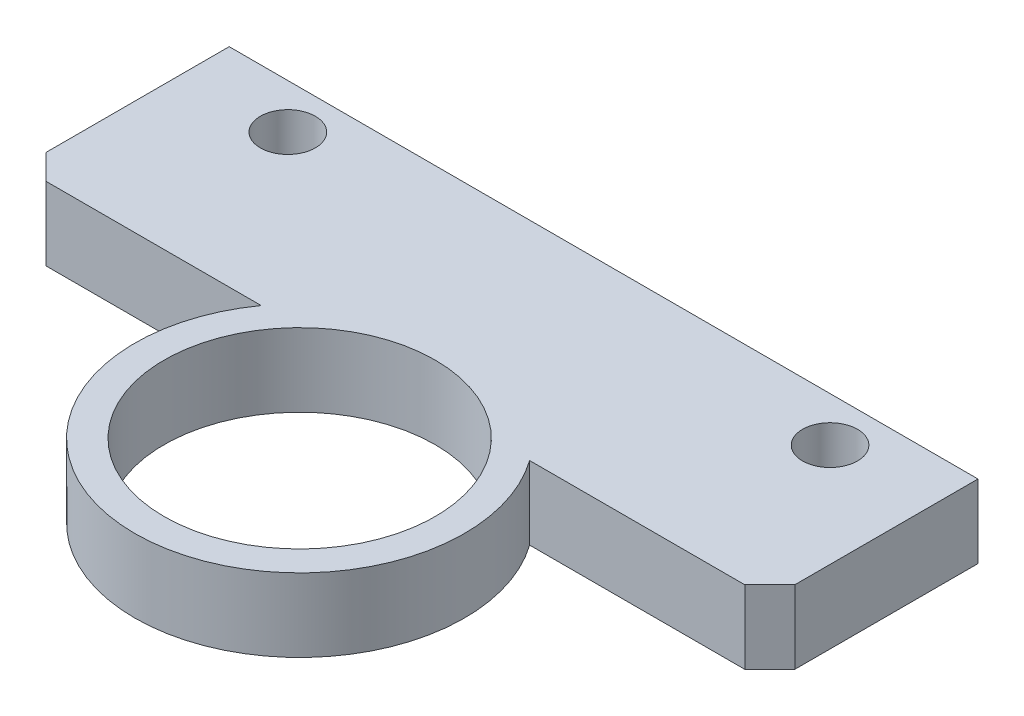
ISO-10303-21;
HEADER;
FILE_DESCRIPTION(('STEP AP214'),'2;1');
FILE_NAME('part.step','',(''),(''),'','','');
FILE_SCHEMA(('AUTOMOTIVE_DESIGN { 1 0 10303 214 1 1 1 1 }'));
ENDSEC;
DATA;
#1=APPLICATION_CONTEXT('core data for automotive mechanical design processes');
#2=APPLICATION_PROTOCOL_DEFINITION('international standard','automotive_design',2000,#1);
#3=PRODUCT_CONTEXT('',#1,'mechanical');
#4=PRODUCT('Part','Part','',(#3));
#5=PRODUCT_RELATED_PRODUCT_CATEGORY('part','',(#4));
#6=PRODUCT_DEFINITION_FORMATION('','',#4);
#7=PRODUCT_DEFINITION_CONTEXT('part definition',#1,'design');
#8=PRODUCT_DEFINITION('design','',#6,#7);
#9=PRODUCT_DEFINITION_SHAPE('','',#8);
#10=(LENGTH_UNIT() NAMED_UNIT(*) SI_UNIT(.MILLI.,.METRE.));
#11=(NAMED_UNIT(*) PLANE_ANGLE_UNIT() SI_UNIT($,.RADIAN.));
#12=(NAMED_UNIT(*) SI_UNIT($,.STERADIAN.) SOLID_ANGLE_UNIT());
#13=UNCERTAINTY_MEASURE_WITH_UNIT(LENGTH_MEASURE(1.E-05),#10,'distance_accuracy_value','');
#14=(GEOMETRIC_REPRESENTATION_CONTEXT(3) GLOBAL_UNCERTAINTY_ASSIGNED_CONTEXT((#13)) GLOBAL_UNIT_ASSIGNED_CONTEXT((#10,
#11,#12)) REPRESENTATION_CONTEXT('',''));
#15=CARTESIAN_POINT('',(0.,0.,0.));
#16=DIRECTION('',(0.,0.,1.));
#17=DIRECTION('',(1.,0.,0.));
#18=AXIS2_PLACEMENT_3D('',#15,#16,#17);
#19=CARTESIAN_POINT('',(0.,10.,0.));
#20=DIRECTION('',(0.,-1.,0.));
#21=DIRECTION('',(0.,0.,-1.));
#22=AXIS2_PLACEMENT_3D('',#19,#20,#21);
#23=CYLINDRICAL_SURFACE('',#22,22.5);
#24=DIRECTION('',(0.,-1.,0.));
#25=VECTOR('',#24,1.);
#26=CARTESIAN_POINT('',(18.3173813247775,10.,-13.0661218960597));
#27=LINE('',#26,#25);
#28=CARTESIAN_POINT('',(18.3173813247775,10.,-13.0661218960597));
#29=VERTEX_POINT('',#28);
#30=CARTESIAN_POINT('',(18.3173813247775,0.,-13.0661218960597));
#31=VERTEX_POINT('',#30);
#32=EDGE_CURVE('E207',#29,#31,#27,.T.);
#33=ORIENTED_EDGE('',*,*,#32,.F.);
#34=CARTESIAN_POINT('',(0.,10.,0.));
#35=DIRECTION('',(0.,1.,0.));
#36=DIRECTION('',(0.,0.,1.));
#37=AXIS2_PLACEMENT_3D('',#34,#35,#36);
#38=CIRCLE('',#37,22.5);
#39=CARTESIAN_POINT('',(-18.3173813247775,10.,-13.0661218960597));
#40=VERTEX_POINT('',#39);
#41=EDGE_CURVE('E11',#40,#29,#38,.T.);
#42=ORIENTED_EDGE('',*,*,#41,.F.);
#43=DIRECTION('',(0.,-1.,0.));
#44=VECTOR('',#43,1.);
#45=CARTESIAN_POINT('',(-18.3173813247775,10.,-13.0661218960597));
#46=LINE('',#45,#44);
#47=CARTESIAN_POINT('',(-18.3173813247775,0.,-13.0661218960597));
#48=VERTEX_POINT('',#47);
#49=EDGE_CURVE('E125',#40,#48,#46,.T.);
#50=ORIENTED_EDGE('',*,*,#49,.T.);
#51=CARTESIAN_POINT('',(0.,0.,0.));
#52=DIRECTION('',(0.,1.,0.));
#53=DIRECTION('',(0.,0.,1.));
#54=AXIS2_PLACEMENT_3D('',#51,#52,#53);
#55=CIRCLE('',#54,22.5);
#56=EDGE_CURVE('E48',#48,#31,#55,.T.);
#57=ORIENTED_EDGE('',*,*,#56,.T.);
#58=EDGE_LOOP('',(#33,#42,#50,#57));
#59=FACE_BOUND('',#58,.T.);
#60=ADVANCED_FACE('F45',(#59),#23,.T.);
#61=CARTESIAN_POINT('',(0.,10.,0.));
#62=DIRECTION('',(0.,1.,0.));
#63=DIRECTION('',(0.,0.,1.));
#64=AXIS2_PLACEMENT_3D('',#61,#62,#63);
#65=PLANE('',#64);
#66=CARTESIAN_POINT('',(0.,10.,0.));
#67=DIRECTION('',(0.,1.,0.));
#68=DIRECTION('',(0.,0.,1.));
#69=AXIS2_PLACEMENT_3D('',#66,#67,#68);
#70=CIRCLE('',#69,18.5);
#71=CARTESIAN_POINT('',(0.,10.,18.5));
#72=VERTEX_POINT('',#71);
#73=EDGE_CURVE('E211',#72,#72,#70,.T.);
#74=ORIENTED_EDGE('',*,*,#73,.F.);
#75=EDGE_LOOP('',(#74));
#76=FACE_BOUND('',#75,.T.);
#77=ORIENTED_EDGE('',*,*,#41,.T.);
#78=DIRECTION('',(1.,0.,0.));
#79=VECTOR('',#78,1.);
#80=CARTESIAN_POINT('',(0.,10.,-13.0661218960597));
#81=LINE('',#80,#79);
#82=CARTESIAN_POINT('',(47.681821621218,10.,-13.0661218960597));
#83=VERTEX_POINT('',#82);
#84=EDGE_CURVE('E105',#29,#83,#81,.T.);
#85=ORIENTED_EDGE('',*,*,#84,.T.);
#86=DIRECTION('',(0.707106781186546,0.,-0.707106781186549));
#87=VECTOR('',#86,1.);
#88=CARTESIAN_POINT('',(17.3078498625793,10.,17.3078498625792));
#89=LINE('',#88,#87);
#90=CARTESIAN_POINT('',(51.0964190292569,10.,-16.4807193040986));
#91=VERTEX_POINT('',#90);
#92=EDGE_CURVE('E110',#83,#91,#89,.T.);
#93=ORIENTED_EDGE('',*,*,#92,.T.);
#94=DIRECTION('',(0.,0.,-1.));
#95=VECTOR('',#94,1.);
#96=CARTESIAN_POINT('',(51.0964190292569,10.,0.));
#97=LINE('',#96,#95);
#98=CARTESIAN_POINT('',(51.0964190292569,10.,-41.4807193040986));
#99=VERTEX_POINT('',#98);
#100=EDGE_CURVE('E132',#91,#99,#97,.T.);
#101=ORIENTED_EDGE('',*,*,#100,.T.);
#102=DIRECTION('',(-1.,0.,0.));
#103=VECTOR('',#102,1.);
#104=CARTESIAN_POINT('',(0.,10.,-41.4807193040986));
#105=LINE('',#104,#103);
#106=CARTESIAN_POINT('',(-51.0964190292569,10.,-41.4807193040985));
#107=VERTEX_POINT('',#106);
#108=EDGE_CURVE('E135',#99,#107,#105,.T.);
#109=ORIENTED_EDGE('',*,*,#108,.T.);
#110=DIRECTION('',(0.,0.,-1.));
#111=VECTOR('',#110,1.);
#112=CARTESIAN_POINT('',(-51.0964190292569,10.,0.));
#113=LINE('',#112,#111);
#114=CARTESIAN_POINT('',(-51.0964190292569,10.,-16.4807193040986));
#115=VERTEX_POINT('',#114);
#116=EDGE_CURVE('E140',#115,#107,#113,.T.);
#117=ORIENTED_EDGE('',*,*,#116,.F.);
#118=DIRECTION('',(-0.707106781186546,0.,-0.707106781186549));
#119=VECTOR('',#118,1.);
#120=CARTESIAN_POINT('',(-17.3078498625793,10.,17.3078498625792));
#121=LINE('',#120,#119);
#122=CARTESIAN_POINT('',(-47.681821621218,10.,-13.0661218960597));
#123=VERTEX_POINT('',#122);
#124=EDGE_CURVE('E144',#123,#115,#121,.T.);
#125=ORIENTED_EDGE('',*,*,#124,.F.);
#126=DIRECTION('',(-1.,0.,0.));
#127=VECTOR('',#126,1.);
#128=CARTESIAN_POINT('',(0.,10.,-13.0661218960597));
#129=LINE('',#128,#127);
#130=EDGE_CURVE('E148',#40,#123,#129,.T.);
#131=ORIENTED_EDGE('',*,*,#130,.F.);
#132=EDGE_LOOP('',(#77,#85,#93,#101,#109,#117,#125,#131));
#133=FACE_BOUND('',#132,.T.);
#134=CARTESIAN_POINT('',(37.,10.,-35.3876597324888));
#135=DIRECTION('',(0.,1.,0.));
#136=DIRECTION('',(0.,0.,1.));
#137=AXIS2_PLACEMENT_3D('',#134,#135,#136);
#138=CIRCLE('',#137,3.75);
#139=CARTESIAN_POINT('',(37.,10.,-31.6376597324888));
#140=VERTEX_POINT('',#139);
#141=EDGE_CURVE('E155',#140,#140,#138,.F.);
#142=ORIENTED_EDGE('',*,*,#141,.T.);
#143=EDGE_LOOP('',(#142));
#144=FACE_BOUND('',#143,.T.);
#145=CARTESIAN_POINT('',(-37.,10.,-35.3876597324888));
#146=DIRECTION('',(0.,1.,0.));
#147=DIRECTION('',(0.,0.,1.));
#148=AXIS2_PLACEMENT_3D('',#145,#146,#147);
#149=CIRCLE('',#148,3.75);
#150=CARTESIAN_POINT('',(-37.,10.,-31.6376597324888));
#151=VERTEX_POINT('',#150);
#152=EDGE_CURVE('E151',#151,#151,#149,.T.);
#153=ORIENTED_EDGE('',*,*,#152,.F.);
#154=EDGE_LOOP('',(#153));
#155=FACE_BOUND('',#154,.T.);
#156=ADVANCED_FACE('F107',(#76,#133,#144,#155),#65,.T.);
#157=CARTESIAN_POINT('',(0.,0.,0.));
#158=DIRECTION('',(0.,1.,0.));
#159=DIRECTION('',(0.,0.,1.));
#160=AXIS2_PLACEMENT_3D('',#157,#158,#159);
#161=PLANE('',#160);
#162=CARTESIAN_POINT('',(0.,0.,0.));
#163=DIRECTION('',(0.,1.,0.));
#164=DIRECTION('',(0.,0.,1.));
#165=AXIS2_PLACEMENT_3D('',#162,#163,#164);
#166=CIRCLE('',#165,18.5);
#167=CARTESIAN_POINT('',(0.,0.,18.5));
#168=VERTEX_POINT('',#167);
#169=EDGE_CURVE('E210',#168,#168,#166,.T.);
#170=ORIENTED_EDGE('',*,*,#169,.T.);
#171=EDGE_LOOP('',(#170));
#172=FACE_BOUND('',#171,.T.);
#173=DIRECTION('',(1.,0.,0.));
#174=VECTOR('',#173,1.);
#175=CARTESIAN_POINT('',(0.,0.,-13.0661218960597));
#176=LINE('',#175,#174);
#177=CARTESIAN_POINT('',(47.681821621218,0.,-13.0661218960597));
#178=VERTEX_POINT('',#177);
#179=EDGE_CURVE('E121',#31,#178,#176,.T.);
#180=ORIENTED_EDGE('',*,*,#179,.F.);
#181=ORIENTED_EDGE('',*,*,#56,.F.);
#182=DIRECTION('',(-1.,0.,0.));
#183=VECTOR('',#182,1.);
#184=CARTESIAN_POINT('',(0.,0.,-13.0661218960597));
#185=LINE('',#184,#183);
#186=CARTESIAN_POINT('',(-47.681821621218,0.,-13.0661218960597));
#187=VERTEX_POINT('',#186);
#188=EDGE_CURVE('E180',#48,#187,#185,.T.);
#189=ORIENTED_EDGE('',*,*,#188,.T.);
#190=DIRECTION('',(-0.707106781186546,0.,-0.707106781186549));
#191=VECTOR('',#190,1.);
#192=CARTESIAN_POINT('',(-17.3078498625793,0.,17.3078498625792));
#193=LINE('',#192,#191);
#194=CARTESIAN_POINT('',(-51.0964190292569,0.,-16.4807193040986));
#195=VERTEX_POINT('',#194);
#196=EDGE_CURVE('E176',#187,#195,#193,.T.);
#197=ORIENTED_EDGE('',*,*,#196,.T.);
#198=DIRECTION('',(0.,0.,-1.));
#199=VECTOR('',#198,1.);
#200=CARTESIAN_POINT('',(-51.0964190292569,0.,0.));
#201=LINE('',#200,#199);
#202=CARTESIAN_POINT('',(-51.0964190292569,0.,-41.4807193040985));
#203=VERTEX_POINT('',#202);
#204=EDGE_CURVE('E172',#195,#203,#201,.T.);
#205=ORIENTED_EDGE('',*,*,#204,.T.);
#206=DIRECTION('',(-1.,0.,0.));
#207=VECTOR('',#206,1.);
#208=CARTESIAN_POINT('',(0.,0.,-41.4807193040986));
#209=LINE('',#208,#207);
#210=CARTESIAN_POINT('',(51.0964190292569,0.,-41.4807193040986));
#211=VERTEX_POINT('',#210);
#212=EDGE_CURVE('E168',#211,#203,#209,.T.);
#213=ORIENTED_EDGE('',*,*,#212,.F.);
#214=DIRECTION('',(0.,0.,-1.));
#215=VECTOR('',#214,1.);
#216=CARTESIAN_POINT('',(51.0964190292569,0.,0.));
#217=LINE('',#216,#215);
#218=CARTESIAN_POINT('',(51.0964190292569,0.,-16.4807193040986));
#219=VERTEX_POINT('',#218);
#220=EDGE_CURVE('E165',#219,#211,#217,.T.);
#221=ORIENTED_EDGE('',*,*,#220,.F.);
#222=DIRECTION('',(0.707106781186546,0.,-0.707106781186549));
#223=VECTOR('',#222,1.);
#224=CARTESIAN_POINT('',(17.3078498625793,0.,17.3078498625792));
#225=LINE('',#224,#223);
#226=EDGE_CURVE('E162',#178,#219,#225,.T.);
#227=ORIENTED_EDGE('',*,*,#226,.F.);
#228=EDGE_LOOP('',(#180,#181,#189,#197,#205,#213,#221,#227));
#229=FACE_BOUND('',#228,.T.);
#230=CARTESIAN_POINT('',(-37.,0.,-35.3876597324888));
#231=DIRECTION('',(0.,1.,0.));
#232=DIRECTION('',(0.,0.,1.));
#233=AXIS2_PLACEMENT_3D('',#230,#231,#232);
#234=CIRCLE('',#233,3.75);
#235=CARTESIAN_POINT('',(-37.,0.,-31.6376597324888));
#236=VERTEX_POINT('',#235);
#237=EDGE_CURVE('E183',#236,#236,#234,.T.);
#238=ORIENTED_EDGE('',*,*,#237,.T.);
#239=EDGE_LOOP('',(#238));
#240=FACE_BOUND('',#239,.T.);
#241=CARTESIAN_POINT('',(37.,0.,-35.3876597324888));
#242=DIRECTION('',(0.,1.,0.));
#243=DIRECTION('',(0.,0.,1.));
#244=AXIS2_PLACEMENT_3D('',#241,#242,#243);
#245=CIRCLE('',#244,3.75);
#246=CARTESIAN_POINT('',(37.,0.,-31.6376597324888));
#247=VERTEX_POINT('',#246);
#248=EDGE_CURVE('E115',#247,#247,#245,.F.);
#249=ORIENTED_EDGE('',*,*,#248,.F.);
#250=EDGE_LOOP('',(#249));
#251=FACE_BOUND('',#250,.T.);
#252=ADVANCED_FACE('F219',(#172,#229,#240,#251),#161,.F.);
#253=CARTESIAN_POINT('',(0.,10.,0.));
#254=DIRECTION('',(0.,-1.,0.));
#255=DIRECTION('',(0.,0.,-1.));
#256=AXIS2_PLACEMENT_3D('',#253,#254,#255);
#257=CYLINDRICAL_SURFACE('',#256,18.5);
#258=ORIENTED_EDGE('',*,*,#169,.F.);
#259=EDGE_LOOP('',(#258));
#260=FACE_BOUND('',#259,.T.);
#261=ORIENTED_EDGE('',*,*,#73,.T.);
#262=EDGE_LOOP('',(#261));
#263=FACE_BOUND('',#262,.T.);
#264=ADVANCED_FACE('F222',(#260,#263),#257,.F.);
#265=CARTESIAN_POINT('',(0.,10.,-13.0661218960597));
#266=DIRECTION('',(0.,0.,-1.));
#267=DIRECTION('',(-1.,0.,0.));
#268=AXIS2_PLACEMENT_3D('',#265,#266,#267);
#269=PLANE('',#268);
#270=ORIENTED_EDGE('',*,*,#84,.F.);
#271=ORIENTED_EDGE('',*,*,#32,.T.);
#272=ORIENTED_EDGE('',*,*,#179,.T.);
#273=DIRECTION('',(0.,-1.,0.));
#274=VECTOR('',#273,1.);
#275=CARTESIAN_POINT('',(47.681821621218,10.,-13.0661218960597));
#276=LINE('',#275,#274);
#277=EDGE_CURVE('E118',#83,#178,#276,.T.);
#278=ORIENTED_EDGE('',*,*,#277,.F.);
#279=EDGE_LOOP('',(#270,#271,#272,#278));
#280=FACE_BOUND('',#279,.T.);
#281=ADVANCED_FACE('F119',(#280),#269,.F.);
#282=CARTESIAN_POINT('',(0.,10.,-13.0661218960597));
#283=DIRECTION('',(0.,0.,1.));
#284=DIRECTION('',(1.,0.,0.));
#285=AXIS2_PLACEMENT_3D('',#282,#283,#284);
#286=PLANE('',#285);
#287=ORIENTED_EDGE('',*,*,#49,.F.);
#288=ORIENTED_EDGE('',*,*,#130,.T.);
#289=DIRECTION('',(0.,-1.,0.));
#290=VECTOR('',#289,1.);
#291=CARTESIAN_POINT('',(-47.681821621218,10.,-13.0661218960597));
#292=LINE('',#291,#290);
#293=EDGE_CURVE('E159',#123,#187,#292,.T.);
#294=ORIENTED_EDGE('',*,*,#293,.T.);
#295=ORIENTED_EDGE('',*,*,#188,.F.);
#296=EDGE_LOOP('',(#287,#288,#294,#295));
#297=FACE_BOUND('',#296,.T.);
#298=ADVANCED_FACE('F237',(#297),#286,.T.);
#299=CARTESIAN_POINT('',(17.3078498625793,10.,17.3078498625792));
#300=DIRECTION('',(-0.707106781186549,0.,-0.707106781186546));
#301=DIRECTION('',(-0.707106781186546,0.,0.707106781186549));
#302=AXIS2_PLACEMENT_3D('',#299,#300,#301);
#303=PLANE('',#302);
#304=ORIENTED_EDGE('',*,*,#226,.T.);
#305=DIRECTION('',(0.,-1.,0.));
#306=VECTOR('',#305,1.);
#307=CARTESIAN_POINT('',(51.0964190292569,10.,-16.4807193040986));
#308=LINE('',#307,#306);
#309=EDGE_CURVE('E126',#91,#219,#308,.T.);
#310=ORIENTED_EDGE('',*,*,#309,.F.);
#311=ORIENTED_EDGE('',*,*,#92,.F.);
#312=ORIENTED_EDGE('',*,*,#277,.T.);
#313=EDGE_LOOP('',(#304,#310,#311,#312));
#314=FACE_BOUND('',#313,.T.);
#315=ADVANCED_FACE('F128',(#314),#303,.F.);
#316=CARTESIAN_POINT('',(51.0964190292569,10.,0.));
#317=DIRECTION('',(-1.,0.,0.));
#318=DIRECTION('',(0.,0.,1.));
#319=AXIS2_PLACEMENT_3D('',#316,#317,#318);
#320=PLANE('',#319);
#321=ORIENTED_EDGE('',*,*,#220,.T.);
#322=DIRECTION('',(0.,-1.,0.));
#323=VECTOR('',#322,1.);
#324=CARTESIAN_POINT('',(51.0964190292569,10.,-41.4807193040986));
#325=LINE('',#324,#323);
#326=EDGE_CURVE('E199',#99,#211,#325,.T.);
#327=ORIENTED_EDGE('',*,*,#326,.F.);
#328=ORIENTED_EDGE('',*,*,#100,.F.);
#329=ORIENTED_EDGE('',*,*,#309,.T.);
#330=EDGE_LOOP('',(#321,#327,#328,#329));
#331=FACE_BOUND('',#330,.T.);
#332=ADVANCED_FACE('F240',(#331),#320,.F.);
#333=CARTESIAN_POINT('',(0.,10.,-41.4807193040986));
#334=DIRECTION('',(0.,0.,1.));
#335=DIRECTION('',(1.,0.,0.));
#336=AXIS2_PLACEMENT_3D('',#333,#334,#335);
#337=PLANE('',#336);
#338=ORIENTED_EDGE('',*,*,#212,.T.);
#339=DIRECTION('',(0.,-1.,0.));
#340=VECTOR('',#339,1.);
#341=CARTESIAN_POINT('',(-51.0964190292569,10.,-41.4807193040985));
#342=LINE('',#341,#340);
#343=EDGE_CURVE('E196',#107,#203,#342,.T.);
#344=ORIENTED_EDGE('',*,*,#343,.F.);
#345=ORIENTED_EDGE('',*,*,#108,.F.);
#346=ORIENTED_EDGE('',*,*,#326,.T.);
#347=EDGE_LOOP('',(#338,#344,#345,#346));
#348=FACE_BOUND('',#347,.T.);
#349=ADVANCED_FACE('F243',(#348),#337,.F.);
#350=CARTESIAN_POINT('',(-51.0964190292569,10.,0.));
#351=DIRECTION('',(-1.,0.,0.));
#352=DIRECTION('',(0.,0.,1.));
#353=AXIS2_PLACEMENT_3D('',#350,#351,#352);
#354=PLANE('',#353);
#355=ORIENTED_EDGE('',*,*,#204,.F.);
#356=DIRECTION('',(0.,-1.,0.));
#357=VECTOR('',#356,1.);
#358=CARTESIAN_POINT('',(-51.0964190292569,10.,-16.4807193040986));
#359=LINE('',#358,#357);
#360=EDGE_CURVE('E193',#115,#195,#359,.T.);
#361=ORIENTED_EDGE('',*,*,#360,.F.);
#362=ORIENTED_EDGE('',*,*,#116,.T.);
#363=ORIENTED_EDGE('',*,*,#343,.T.);
#364=EDGE_LOOP('',(#355,#361,#362,#363));
#365=FACE_BOUND('',#364,.T.);
#366=ADVANCED_FACE('F247',(#365),#354,.T.);
#367=CARTESIAN_POINT('',(-17.3078498625793,10.,17.3078498625792));
#368=DIRECTION('',(-0.707106781186549,0.,0.707106781186546));
#369=DIRECTION('',(0.707106781186546,0.,0.707106781186549));
#370=AXIS2_PLACEMENT_3D('',#367,#368,#369);
#371=PLANE('',#370);
#372=ORIENTED_EDGE('',*,*,#196,.F.);
#373=ORIENTED_EDGE('',*,*,#293,.F.);
#374=ORIENTED_EDGE('',*,*,#124,.T.);
#375=ORIENTED_EDGE('',*,*,#360,.T.);
#376=EDGE_LOOP('',(#372,#373,#374,#375));
#377=FACE_BOUND('',#376,.T.);
#378=ADVANCED_FACE('F251',(#377),#371,.T.);
#379=CARTESIAN_POINT('',(-37.,10.,-35.3876597324888));
#380=DIRECTION('',(0.,-1.,0.));
#381=DIRECTION('',(0.,0.,-1.));
#382=AXIS2_PLACEMENT_3D('',#379,#380,#381);
#383=CYLINDRICAL_SURFACE('',#382,3.75);
#384=ORIENTED_EDGE('',*,*,#152,.T.);
#385=EDGE_LOOP('',(#384));
#386=FACE_BOUND('',#385,.T.);
#387=ORIENTED_EDGE('',*,*,#237,.F.);
#388=EDGE_LOOP('',(#387));
#389=FACE_BOUND('',#388,.T.);
#390=ADVANCED_FACE('F255',(#386,#389),#383,.F.);
#391=CARTESIAN_POINT('',(37.,10.,-35.3876597324888));
#392=DIRECTION('',(0.,-1.,0.));
#393=DIRECTION('',(0.,0.,-1.));
#394=AXIS2_PLACEMENT_3D('',#391,#392,#393);
#395=CYLINDRICAL_SURFACE('',#394,3.75);
#396=ORIENTED_EDGE('',*,*,#141,.F.);
#397=EDGE_LOOP('',(#396));
#398=FACE_BOUND('',#397,.T.);
#399=ORIENTED_EDGE('',*,*,#248,.T.);
#400=EDGE_LOOP('',(#399));
#401=FACE_BOUND('',#400,.T.);
#402=ADVANCED_FACE('F262',(#398,#401),#395,.F.);
#403=CLOSED_SHELL('',(#60,#156,#252,#264,#281,#298,#315,#332,#349,#366,#378,#390,#402));
#404=MANIFOLD_SOLID_BREP('B2',#403);
#405=ADVANCED_BREP_SHAPE_REPRESENTATION('',(#18,#404),#14);
#406=SHAPE_DEFINITION_REPRESENTATION(#9,#405);
ENDSEC;
END-ISO-10303-21;
